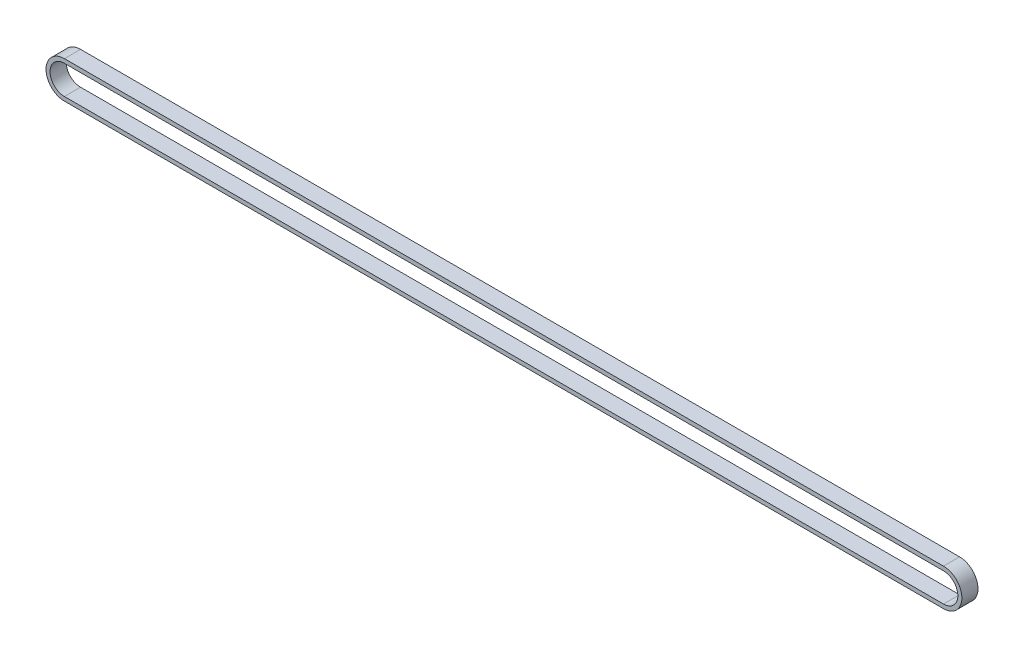
ISO-10303-21;
HEADER;
FILE_DESCRIPTION(('STEP AP214'),'2;1');
FILE_NAME('part.step','',(''),(''),'','','');
FILE_SCHEMA(('AUTOMOTIVE_DESIGN { 1 0 10303 214 1 1 1 1 }'));
ENDSEC;
DATA;
#1=APPLICATION_CONTEXT('core data for automotive mechanical design processes');
#2=APPLICATION_PROTOCOL_DEFINITION('international standard','automotive_design',2000,#1);
#3=PRODUCT_CONTEXT('',#1,'mechanical');
#4=PRODUCT('Part','Part','',(#3));
#5=PRODUCT_RELATED_PRODUCT_CATEGORY('part','',(#4));
#6=PRODUCT_DEFINITION_FORMATION('','',#4);
#7=PRODUCT_DEFINITION_CONTEXT('part definition',#1,'design');
#8=PRODUCT_DEFINITION('design','',#6,#7);
#9=PRODUCT_DEFINITION_SHAPE('','',#8);
#10=(LENGTH_UNIT() NAMED_UNIT(*) SI_UNIT(.MILLI.,.METRE.));
#11=(NAMED_UNIT(*) PLANE_ANGLE_UNIT() SI_UNIT($,.RADIAN.));
#12=(NAMED_UNIT(*) SI_UNIT($,.STERADIAN.) SOLID_ANGLE_UNIT());
#13=UNCERTAINTY_MEASURE_WITH_UNIT(LENGTH_MEASURE(1.E-05),#10,'distance_accuracy_value','');
#14=(GEOMETRIC_REPRESENTATION_CONTEXT(3) GLOBAL_UNCERTAINTY_ASSIGNED_CONTEXT((#13)) GLOBAL_UNIT_ASSIGNED_CONTEXT((#10,
#11,#12)) REPRESENTATION_CONTEXT('',''));
#15=CARTESIAN_POINT('',(0.,0.,0.));
#16=DIRECTION('',(0.,0.,1.));
#17=DIRECTION('',(1.,0.,0.));
#18=AXIS2_PLACEMENT_3D('',#15,#16,#17);
#19=CARTESIAN_POINT('',(-163.5,0.,3.));
#20=DIRECTION('',(0.,0.,1.));
#21=DIRECTION('',(1.,0.,0.));
#22=AXIS2_PLACEMENT_3D('',#19,#20,#21);
#23=PLANE('',#22);
#24=CARTESIAN_POINT('',(-163.5,0.,3.));
#25=DIRECTION('',(0.,0.,1.));
#26=DIRECTION('',(1.,0.,0.));
#27=AXIS2_PLACEMENT_3D('',#24,#25,#26);
#28=CIRCLE('',#27,6.85);
#29=CARTESIAN_POINT('',(-163.5,6.85,3.));
#30=VERTEX_POINT('',#29);
#31=CARTESIAN_POINT('',(-163.5,-6.85,3.));
#32=VERTEX_POINT('',#31);
#33=EDGE_CURVE('E157',#30,#32,#28,.T.);
#34=ORIENTED_EDGE('',*,*,#33,.T.);
#35=DIRECTION('',(1.,0.,0.));
#36=VECTOR('',#35,1.);
#37=CARTESIAN_POINT('',(-163.5,-6.85,3.));
#38=LINE('',#37,#36);
#39=CARTESIAN_POINT('',(163.5,-6.84999999999994,3.));
#40=VERTEX_POINT('',#39);
#41=EDGE_CURVE('E160',#32,#40,#38,.T.);
#42=ORIENTED_EDGE('',*,*,#41,.T.);
#43=CARTESIAN_POINT('',(163.5,0.,3.));
#44=DIRECTION('',(0.,0.,1.));
#45=DIRECTION('',(1.,0.,0.));
#46=AXIS2_PLACEMENT_3D('',#43,#44,#45);
#47=CIRCLE('',#46,6.85);
#48=CARTESIAN_POINT('',(163.5,6.85000000000006,3.));
#49=VERTEX_POINT('',#48);
#50=EDGE_CURVE('E163',#40,#49,#47,.T.);
#51=ORIENTED_EDGE('',*,*,#50,.T.);
#52=DIRECTION('',(1.,0.,0.));
#53=VECTOR('',#52,1.);
#54=CARTESIAN_POINT('',(-163.5,6.85,3.));
#55=LINE('',#54,#53);
#56=EDGE_CURVE('E165',#30,#49,#55,.T.);
#57=ORIENTED_EDGE('',*,*,#56,.F.);
#58=EDGE_LOOP('',(#34,#42,#51,#57));
#59=FACE_BOUND('',#58,.T.);
#60=DIRECTION('',(1.,0.,0.));
#61=VECTOR('',#60,1.);
#62=CARTESIAN_POINT('',(-163.5,-5.35,3.));
#63=LINE('',#62,#61);
#64=CARTESIAN_POINT('',(-163.5,-5.35,3.));
#65=VERTEX_POINT('',#64);
#66=CARTESIAN_POINT('',(163.5,-5.34999999999994,3.));
#67=VERTEX_POINT('',#66);
#68=EDGE_CURVE('E130',#65,#67,#63,.T.);
#69=ORIENTED_EDGE('',*,*,#68,.F.);
#70=CARTESIAN_POINT('',(-163.5,0.,3.));
#71=DIRECTION('',(0.,0.,1.));
#72=DIRECTION('',(1.,0.,0.));
#73=AXIS2_PLACEMENT_3D('',#70,#71,#72);
#74=CIRCLE('',#73,5.35);
#75=CARTESIAN_POINT('',(-163.5,5.35,3.));
#76=VERTEX_POINT('',#75);
#77=EDGE_CURVE('E122',#76,#65,#74,.T.);
#78=ORIENTED_EDGE('',*,*,#77,.F.);
#79=DIRECTION('',(1.,0.,0.));
#80=VECTOR('',#79,1.);
#81=CARTESIAN_POINT('',(-163.5,5.35,3.));
#82=LINE('',#81,#80);
#83=CARTESIAN_POINT('',(163.5,5.35000000000006,3.));
#84=VERTEX_POINT('',#83);
#85=EDGE_CURVE('E144',#76,#84,#82,.T.);
#86=ORIENTED_EDGE('',*,*,#85,.T.);
#87=CARTESIAN_POINT('',(163.5,0.,3.));
#88=DIRECTION('',(0.,0.,1.));
#89=DIRECTION('',(1.,0.,0.));
#90=AXIS2_PLACEMENT_3D('',#87,#88,#89);
#91=CIRCLE('',#90,5.35);
#92=EDGE_CURVE('E142',#67,#84,#91,.T.);
#93=ORIENTED_EDGE('',*,*,#92,.F.);
#94=EDGE_LOOP('',(#69,#78,#86,#93));
#95=FACE_BOUND('',#94,.T.);
#96=ADVANCED_FACE('F57',(#59,#95),#23,.T.);
#97=CARTESIAN_POINT('',(-163.5,0.,-3.));
#98=DIRECTION('',(0.,0.,1.));
#99=DIRECTION('',(1.,0.,0.));
#100=AXIS2_PLACEMENT_3D('',#97,#98,#99);
#101=PLANE('',#100);
#102=CARTESIAN_POINT('',(-163.5,0.,-3.));
#103=DIRECTION('',(0.,0.,1.));
#104=DIRECTION('',(1.,0.,0.));
#105=AXIS2_PLACEMENT_3D('',#102,#103,#104);
#106=CIRCLE('',#105,6.85);
#107=CARTESIAN_POINT('',(-163.5,6.85,-3.));
#108=VERTEX_POINT('',#107);
#109=CARTESIAN_POINT('',(-163.5,-6.85,-3.));
#110=VERTEX_POINT('',#109);
#111=EDGE_CURVE('E138',#108,#110,#106,.T.);
#112=ORIENTED_EDGE('',*,*,#111,.F.);
#113=DIRECTION('',(1.,0.,0.));
#114=VECTOR('',#113,1.);
#115=CARTESIAN_POINT('',(-163.5,6.85,-3.));
#116=LINE('',#115,#114);
#117=CARTESIAN_POINT('',(163.5,6.85000000000006,-3.));
#118=VERTEX_POINT('',#117);
#119=EDGE_CURVE('E161',#108,#118,#116,.T.);
#120=ORIENTED_EDGE('',*,*,#119,.T.);
#121=CARTESIAN_POINT('',(163.5,0.,-3.));
#122=DIRECTION('',(0.,0.,1.));
#123=DIRECTION('',(1.,0.,0.));
#124=AXIS2_PLACEMENT_3D('',#121,#122,#123);
#125=CIRCLE('',#124,6.85);
#126=CARTESIAN_POINT('',(163.5,-6.84999999999994,-3.));
#127=VERTEX_POINT('',#126);
#128=EDGE_CURVE('E173',#127,#118,#125,.T.);
#129=ORIENTED_EDGE('',*,*,#128,.F.);
#130=DIRECTION('',(1.,0.,0.));
#131=VECTOR('',#130,1.);
#132=CARTESIAN_POINT('',(-163.5,-6.85,-3.));
#133=LINE('',#132,#131);
#134=EDGE_CURVE('E171',#110,#127,#133,.T.);
#135=ORIENTED_EDGE('',*,*,#134,.F.);
#136=EDGE_LOOP('',(#112,#120,#129,#135));
#137=FACE_BOUND('',#136,.T.);
#138=CARTESIAN_POINT('',(-163.5,0.,-3.));
#139=DIRECTION('',(0.,0.,1.));
#140=DIRECTION('',(1.,0.,0.));
#141=AXIS2_PLACEMENT_3D('',#138,#139,#140);
#142=CIRCLE('',#141,5.35);
#143=CARTESIAN_POINT('',(-163.5,5.35,-3.));
#144=VERTEX_POINT('',#143);
#145=CARTESIAN_POINT('',(-163.5,-5.35,-3.));
#146=VERTEX_POINT('',#145);
#147=EDGE_CURVE('E80',#144,#146,#142,.T.);
#148=ORIENTED_EDGE('',*,*,#147,.T.);
#149=DIRECTION('',(1.,0.,0.));
#150=VECTOR('',#149,1.);
#151=CARTESIAN_POINT('',(-163.5,-5.35,-3.));
#152=LINE('',#151,#150);
#153=CARTESIAN_POINT('',(163.5,-5.34999999999994,-3.));
#154=VERTEX_POINT('',#153);
#155=EDGE_CURVE('E137',#146,#154,#152,.T.);
#156=ORIENTED_EDGE('',*,*,#155,.T.);
#157=CARTESIAN_POINT('',(163.5,0.,-3.));
#158=DIRECTION('',(0.,0.,1.));
#159=DIRECTION('',(1.,0.,0.));
#160=AXIS2_PLACEMENT_3D('',#157,#158,#159);
#161=CIRCLE('',#160,5.35);
#162=CARTESIAN_POINT('',(163.5,5.35000000000006,-3.));
#163=VERTEX_POINT('',#162);
#164=EDGE_CURVE('E150',#154,#163,#161,.T.);
#165=ORIENTED_EDGE('',*,*,#164,.T.);
#166=DIRECTION('',(1.,0.,0.));
#167=VECTOR('',#166,1.);
#168=CARTESIAN_POINT('',(-163.5,5.35,-3.));
#169=LINE('',#168,#167);
#170=EDGE_CURVE('E131',#144,#163,#169,.T.);
#171=ORIENTED_EDGE('',*,*,#170,.F.);
#172=EDGE_LOOP('',(#148,#156,#165,#171));
#173=FACE_BOUND('',#172,.T.);
#174=ADVANCED_FACE('F190',(#137,#173),#101,.F.);
#175=CARTESIAN_POINT('',(-163.5,0.,3.));
#176=DIRECTION('',(0.,0.,-1.));
#177=DIRECTION('',(-1.,0.,0.));
#178=AXIS2_PLACEMENT_3D('',#175,#176,#177);
#179=CYLINDRICAL_SURFACE('',#178,6.85);
#180=ORIENTED_EDGE('',*,*,#111,.T.);
#181=DIRECTION('',(0.,0.,-1.));
#182=VECTOR('',#181,1.);
#183=CARTESIAN_POINT('',(-163.5,-6.85,3.));
#184=LINE('',#183,#182);
#185=EDGE_CURVE('E12',#32,#110,#184,.T.);
#186=ORIENTED_EDGE('',*,*,#185,.F.);
#187=ORIENTED_EDGE('',*,*,#33,.F.);
#188=DIRECTION('',(0.,0.,-1.));
#189=VECTOR('',#188,1.);
#190=CARTESIAN_POINT('',(-163.5,6.85,3.));
#191=LINE('',#190,#189);
#192=EDGE_CURVE('E168',#30,#108,#191,.T.);
#193=ORIENTED_EDGE('',*,*,#192,.T.);
#194=EDGE_LOOP('',(#180,#186,#187,#193));
#195=FACE_BOUND('',#194,.T.);
#196=ADVANCED_FACE('F59',(#195),#179,.T.);
#197=CARTESIAN_POINT('',(-163.5,-6.85,3.));
#198=DIRECTION('',(0.,1.,0.));
#199=DIRECTION('',(-1.,0.,0.));
#200=AXIS2_PLACEMENT_3D('',#197,#198,#199);
#201=PLANE('',#200);
#202=ORIENTED_EDGE('',*,*,#134,.T.);
#203=DIRECTION('',(0.,0.,-1.));
#204=VECTOR('',#203,1.);
#205=CARTESIAN_POINT('',(163.5,-6.84999999999994,3.));
#206=LINE('',#205,#204);
#207=EDGE_CURVE('E65',#40,#127,#206,.T.);
#208=ORIENTED_EDGE('',*,*,#207,.F.);
#209=ORIENTED_EDGE('',*,*,#41,.F.);
#210=ORIENTED_EDGE('',*,*,#185,.T.);
#211=EDGE_LOOP('',(#202,#208,#209,#210));
#212=FACE_BOUND('',#211,.T.);
#213=ADVANCED_FACE('F199',(#212),#201,.F.);
#214=CARTESIAN_POINT('',(163.5,0.,3.));
#215=DIRECTION('',(0.,0.,-1.));
#216=DIRECTION('',(-1.,0.,0.));
#217=AXIS2_PLACEMENT_3D('',#214,#215,#216);
#218=CYLINDRICAL_SURFACE('',#217,6.85);
#219=ORIENTED_EDGE('',*,*,#128,.T.);
#220=DIRECTION('',(0.,0.,-1.));
#221=VECTOR('',#220,1.);
#222=CARTESIAN_POINT('',(163.5,6.85000000000006,3.));
#223=LINE('',#222,#221);
#224=EDGE_CURVE('E179',#49,#118,#223,.T.);
#225=ORIENTED_EDGE('',*,*,#224,.F.);
#226=ORIENTED_EDGE('',*,*,#50,.F.);
#227=ORIENTED_EDGE('',*,*,#207,.T.);
#228=EDGE_LOOP('',(#219,#225,#226,#227));
#229=FACE_BOUND('',#228,.T.);
#230=ADVANCED_FACE('F185',(#229),#218,.T.);
#231=CARTESIAN_POINT('',(-163.5,6.85,3.));
#232=DIRECTION('',(0.,1.,0.));
#233=DIRECTION('',(-1.,0.,0.));
#234=AXIS2_PLACEMENT_3D('',#231,#232,#233);
#235=PLANE('',#234);
#236=ORIENTED_EDGE('',*,*,#119,.F.);
#237=ORIENTED_EDGE('',*,*,#192,.F.);
#238=ORIENTED_EDGE('',*,*,#56,.T.);
#239=ORIENTED_EDGE('',*,*,#224,.T.);
#240=EDGE_LOOP('',(#236,#237,#238,#239));
#241=FACE_BOUND('',#240,.T.);
#242=ADVANCED_FACE('F194',(#241),#235,.T.);
#243=CARTESIAN_POINT('',(-163.5,0.,3.));
#244=DIRECTION('',(0.,0.,-1.));
#245=DIRECTION('',(-1.,0.,0.));
#246=AXIS2_PLACEMENT_3D('',#243,#244,#245);
#247=CYLINDRICAL_SURFACE('',#246,5.35);
#248=ORIENTED_EDGE('',*,*,#147,.F.);
#249=DIRECTION('',(0.,0.,-1.));
#250=VECTOR('',#249,1.);
#251=CARTESIAN_POINT('',(-163.5,5.35,3.));
#252=LINE('',#251,#250);
#253=EDGE_CURVE('E126',#76,#144,#252,.T.);
#254=ORIENTED_EDGE('',*,*,#253,.F.);
#255=ORIENTED_EDGE('',*,*,#77,.T.);
#256=DIRECTION('',(0.,0.,-1.));
#257=VECTOR('',#256,1.);
#258=CARTESIAN_POINT('',(-163.5,-5.35,3.));
#259=LINE('',#258,#257);
#260=EDGE_CURVE('E125',#65,#146,#259,.T.);
#261=ORIENTED_EDGE('',*,*,#260,.T.);
#262=EDGE_LOOP('',(#248,#254,#255,#261));
#263=FACE_BOUND('',#262,.T.);
#264=ADVANCED_FACE('F124',(#263),#247,.F.);
#265=CARTESIAN_POINT('',(-163.5,-5.35,3.));
#266=DIRECTION('',(0.,1.,0.));
#267=DIRECTION('',(-1.,0.,0.));
#268=AXIS2_PLACEMENT_3D('',#265,#266,#267);
#269=PLANE('',#268);
#270=ORIENTED_EDGE('',*,*,#155,.F.);
#271=ORIENTED_EDGE('',*,*,#260,.F.);
#272=ORIENTED_EDGE('',*,*,#68,.T.);
#273=DIRECTION('',(0.,0.,-1.));
#274=VECTOR('',#273,1.);
#275=CARTESIAN_POINT('',(163.5,-5.34999999999994,3.));
#276=LINE('',#275,#274);
#277=EDGE_CURVE('E139',#67,#154,#276,.T.);
#278=ORIENTED_EDGE('',*,*,#277,.T.);
#279=EDGE_LOOP('',(#270,#271,#272,#278));
#280=FACE_BOUND('',#279,.T.);
#281=ADVANCED_FACE('F134',(#280),#269,.T.);
#282=CARTESIAN_POINT('',(163.5,0.,3.));
#283=DIRECTION('',(0.,0.,-1.));
#284=DIRECTION('',(-1.,0.,0.));
#285=AXIS2_PLACEMENT_3D('',#282,#283,#284);
#286=CYLINDRICAL_SURFACE('',#285,5.35);
#287=ORIENTED_EDGE('',*,*,#164,.F.);
#288=ORIENTED_EDGE('',*,*,#277,.F.);
#289=ORIENTED_EDGE('',*,*,#92,.T.);
#290=DIRECTION('',(0.,0.,-1.));
#291=VECTOR('',#290,1.);
#292=CARTESIAN_POINT('',(163.5,5.35000000000006,3.));
#293=LINE('',#292,#291);
#294=EDGE_CURVE('E72',#84,#163,#293,.T.);
#295=ORIENTED_EDGE('',*,*,#294,.T.);
#296=EDGE_LOOP('',(#287,#288,#289,#295));
#297=FACE_BOUND('',#296,.T.);
#298=ADVANCED_FACE('F236',(#297),#286,.F.);
#299=CARTESIAN_POINT('',(-163.5,5.35,3.));
#300=DIRECTION('',(0.,1.,0.));
#301=DIRECTION('',(-1.,0.,0.));
#302=AXIS2_PLACEMENT_3D('',#299,#300,#301);
#303=PLANE('',#302);
#304=ORIENTED_EDGE('',*,*,#170,.T.);
#305=ORIENTED_EDGE('',*,*,#294,.F.);
#306=ORIENTED_EDGE('',*,*,#85,.F.);
#307=ORIENTED_EDGE('',*,*,#253,.T.);
#308=EDGE_LOOP('',(#304,#305,#306,#307));
#309=FACE_BOUND('',#308,.T.);
#310=ADVANCED_FACE('F242',(#309),#303,.F.);
#311=CLOSED_SHELL('',(#96,#174,#196,#213,#230,#242,#264,#281,#298,#310));
#312=MANIFOLD_SOLID_BREP('B2',#311);
#313=ADVANCED_BREP_SHAPE_REPRESENTATION('',(#18,#312),#14);
#314=SHAPE_DEFINITION_REPRESENTATION(#9,#313);
ENDSEC;
END-ISO-10303-21;
